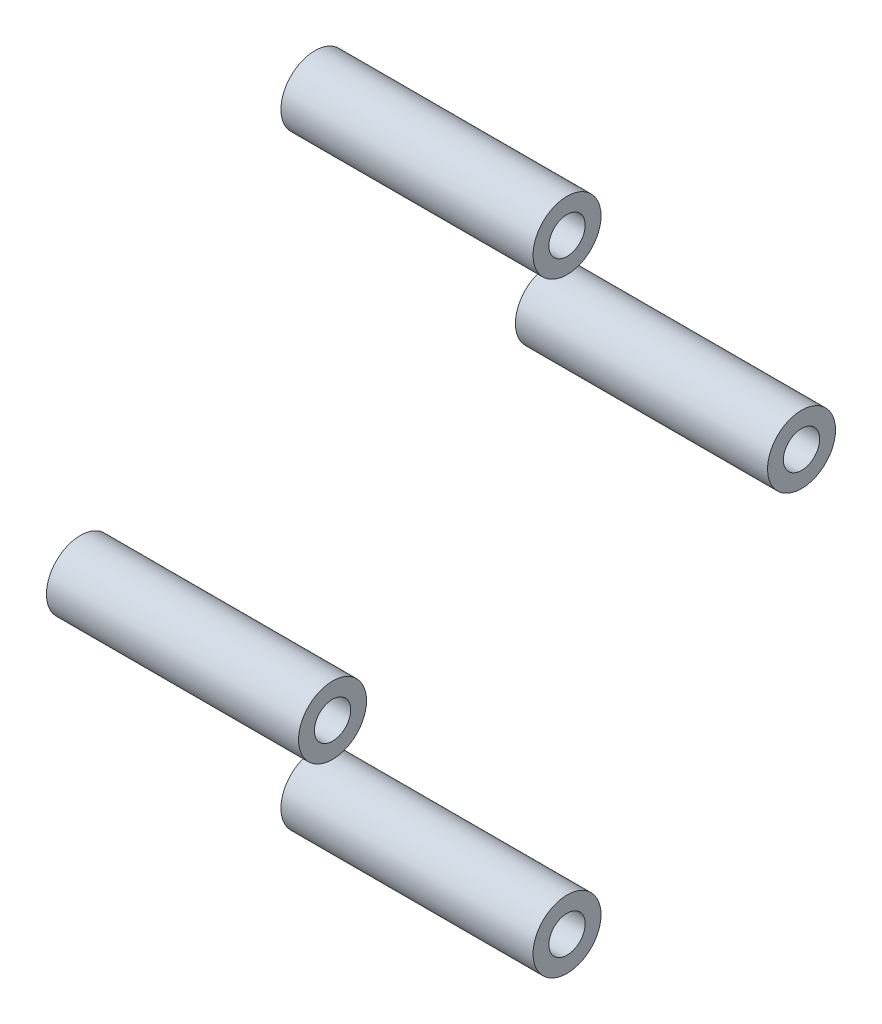
ISO-10303-21;
HEADER;
FILE_DESCRIPTION(('STEP AP214'),'2;1');
FILE_NAME('part.step','',(''),(''),'','','');
FILE_SCHEMA(('AUTOMOTIVE_DESIGN { 1 0 10303 214 1 1 1 1 }'));
ENDSEC;
DATA;
#1=APPLICATION_CONTEXT('core data for automotive mechanical design processes');
#2=APPLICATION_PROTOCOL_DEFINITION('international standard','automotive_design',2000,#1);
#3=PRODUCT_CONTEXT('',#1,'mechanical');
#4=PRODUCT('Part','Part','',(#3));
#5=PRODUCT_RELATED_PRODUCT_CATEGORY('part','',(#4));
#6=PRODUCT_DEFINITION_FORMATION('','',#4);
#7=PRODUCT_DEFINITION_CONTEXT('part definition',#1,'design');
#8=PRODUCT_DEFINITION('design','',#6,#7);
#9=PRODUCT_DEFINITION_SHAPE('','',#8);
#10=(LENGTH_UNIT() NAMED_UNIT(*) SI_UNIT(.MILLI.,.METRE.));
#11=(NAMED_UNIT(*) PLANE_ANGLE_UNIT() SI_UNIT($,.RADIAN.));
#12=(NAMED_UNIT(*) SI_UNIT($,.STERADIAN.) SOLID_ANGLE_UNIT());
#13=UNCERTAINTY_MEASURE_WITH_UNIT(LENGTH_MEASURE(1.E-05),#10,'distance_accuracy_value','');
#14=(GEOMETRIC_REPRESENTATION_CONTEXT(3) GLOBAL_UNCERTAINTY_ASSIGNED_CONTEXT((#13)) GLOBAL_UNIT_ASSIGNED_CONTEXT((#10,
#11,#12)) REPRESENTATION_CONTEXT('',''));
#15=CARTESIAN_POINT('',(0.,0.,0.));
#16=DIRECTION('',(0.,0.,1.));
#17=DIRECTION('',(1.,0.,0.));
#18=AXIS2_PLACEMENT_3D('',#15,#16,#17);
#19=CARTESIAN_POINT('',(25.,-30.,0.));
#20=DIRECTION('',(1.,0.,0.));
#21=DIRECTION('',(0.,0.,-1.));
#22=AXIS2_PLACEMENT_3D('',#19,#20,#21);
#23=PLANE('',#22);
#24=CARTESIAN_POINT('',(25.,-30.,0.));
#25=DIRECTION('',(1.,0.,0.));
#26=DIRECTION('',(0.,0.,-1.));
#27=AXIS2_PLACEMENT_3D('',#24,#25,#26);
#28=CIRCLE('',#27,3.37);
#29=CARTESIAN_POINT('',(25.,-30.,-3.37));
#30=VERTEX_POINT('',#29);
#31=EDGE_CURVE('E56',#30,#30,#28,.T.);
#32=ORIENTED_EDGE('',*,*,#31,.T.);
#33=EDGE_LOOP('',(#32));
#34=FACE_BOUND('',#33,.T.);
#35=CARTESIAN_POINT('',(25.,-30.,0.));
#36=DIRECTION('',(1.,0.,0.));
#37=DIRECTION('',(0.,0.,-1.));
#38=AXIS2_PLACEMENT_3D('',#35,#36,#37);
#39=CIRCLE('',#38,1.8);
#40=CARTESIAN_POINT('',(25.,-30.,-1.8));
#41=VERTEX_POINT('',#40);
#42=EDGE_CURVE('E49',#41,#41,#39,.T.);
#43=ORIENTED_EDGE('',*,*,#42,.F.);
#44=EDGE_LOOP('',(#43));
#45=FACE_BOUND('',#44,.T.);
#46=ADVANCED_FACE('F46',(#34,#45),#23,.T.);
#47=CARTESIAN_POINT('',(0.,-30.,0.));
#48=DIRECTION('',(1.,0.,0.));
#49=DIRECTION('',(0.,0.,-1.));
#50=AXIS2_PLACEMENT_3D('',#47,#48,#49);
#51=PLANE('',#50);
#52=CARTESIAN_POINT('',(0.,-30.,0.));
#53=DIRECTION('',(1.,0.,0.));
#54=DIRECTION('',(0.,0.,-1.));
#55=AXIS2_PLACEMENT_3D('',#52,#53,#54);
#56=CIRCLE('',#55,3.37);
#57=CARTESIAN_POINT('',(0.,-30.,-3.37));
#58=VERTEX_POINT('',#57);
#59=EDGE_CURVE('E60',#58,#58,#56,.T.);
#60=ORIENTED_EDGE('',*,*,#59,.F.);
#61=EDGE_LOOP('',(#60));
#62=FACE_BOUND('',#61,.T.);
#63=CARTESIAN_POINT('',(0.,-30.,0.));
#64=DIRECTION('',(1.,0.,0.));
#65=DIRECTION('',(0.,0.,-1.));
#66=AXIS2_PLACEMENT_3D('',#63,#64,#65);
#67=CIRCLE('',#66,1.8);
#68=CARTESIAN_POINT('',(0.,-30.,-1.8));
#69=VERTEX_POINT('',#68);
#70=EDGE_CURVE('E11',#69,#69,#67,.T.);
#71=ORIENTED_EDGE('',*,*,#70,.T.);
#72=EDGE_LOOP('',(#71));
#73=FACE_BOUND('',#72,.T.);
#74=ADVANCED_FACE('F70',(#62,#73),#51,.F.);
#75=CARTESIAN_POINT('',(25.,-30.,0.));
#76=DIRECTION('',(-1.,0.,0.));
#77=DIRECTION('',(0.,0.,1.));
#78=AXIS2_PLACEMENT_3D('',#75,#76,#77);
#79=CYLINDRICAL_SURFACE('',#78,3.37);
#80=ORIENTED_EDGE('',*,*,#31,.F.);
#81=EDGE_LOOP('',(#80));
#82=FACE_BOUND('',#81,.T.);
#83=ORIENTED_EDGE('',*,*,#59,.T.);
#84=EDGE_LOOP('',(#83));
#85=FACE_BOUND('',#84,.T.);
#86=ADVANCED_FACE('F62',(#82,#85),#79,.T.);
#87=CARTESIAN_POINT('',(25.,-30.,0.));
#88=DIRECTION('',(-1.,0.,0.));
#89=DIRECTION('',(0.,0.,1.));
#90=AXIS2_PLACEMENT_3D('',#87,#88,#89);
#91=CYLINDRICAL_SURFACE('',#90,1.8);
#92=ORIENTED_EDGE('',*,*,#42,.T.);
#93=EDGE_LOOP('',(#92));
#94=FACE_BOUND('',#93,.T.);
#95=ORIENTED_EDGE('',*,*,#70,.F.);
#96=EDGE_LOOP('',(#95));
#97=FACE_BOUND('',#96,.T.);
#98=ADVANCED_FACE('F48',(#94,#97),#91,.F.);
#99=CLOSED_SHELL('',(#46,#74,#86,#98));
#100=MANIFOLD_SOLID_BREP('B2',#99);
#101=CARTESIAN_POINT('',(25.,0.,-23.25));
#102=DIRECTION('',(1.,0.,0.));
#103=DIRECTION('',(0.,0.,-1.));
#104=AXIS2_PLACEMENT_3D('',#101,#102,#103);
#105=PLANE('',#104);
#106=CARTESIAN_POINT('',(25.,0.,-23.25));
#107=DIRECTION('',(1.,0.,0.));
#108=DIRECTION('',(0.,0.,-1.));
#109=AXIS2_PLACEMENT_3D('',#106,#107,#108);
#110=CIRCLE('',#109,3.37);
#111=CARTESIAN_POINT('',(25.,0.,-26.62));
#112=VERTEX_POINT('',#111);
#113=EDGE_CURVE('E129',#112,#112,#110,.T.);
#114=ORIENTED_EDGE('',*,*,#113,.T.);
#115=EDGE_LOOP('',(#114));
#116=FACE_BOUND('',#115,.T.);
#117=CARTESIAN_POINT('',(25.,0.,-23.25));
#118=DIRECTION('',(1.,0.,0.));
#119=DIRECTION('',(0.,0.,-1.));
#120=AXIS2_PLACEMENT_3D('',#117,#118,#119);
#121=CIRCLE('',#120,1.8);
#122=CARTESIAN_POINT('',(25.,0.,-25.05));
#123=VERTEX_POINT('',#122);
#124=EDGE_CURVE('E117',#123,#123,#121,.T.);
#125=ORIENTED_EDGE('',*,*,#124,.F.);
#126=EDGE_LOOP('',(#125));
#127=FACE_BOUND('',#126,.T.);
#128=ADVANCED_FACE('F118',(#116,#127),#105,.T.);
#129=CARTESIAN_POINT('',(0.,0.,-23.25));
#130=DIRECTION('',(1.,0.,0.));
#131=DIRECTION('',(0.,0.,-1.));
#132=AXIS2_PLACEMENT_3D('',#129,#130,#131);
#133=PLANE('',#132);
#134=CARTESIAN_POINT('',(0.,0.,-23.25));
#135=DIRECTION('',(1.,0.,0.));
#136=DIRECTION('',(0.,0.,-1.));
#137=AXIS2_PLACEMENT_3D('',#134,#135,#136);
#138=CIRCLE('',#137,3.37);
#139=CARTESIAN_POINT('',(0.,0.,-26.62));
#140=VERTEX_POINT('',#139);
#141=EDGE_CURVE('E130',#140,#140,#138,.T.);
#142=ORIENTED_EDGE('',*,*,#141,.F.);
#143=EDGE_LOOP('',(#142));
#144=FACE_BOUND('',#143,.T.);
#145=CARTESIAN_POINT('',(0.,0.,-23.25));
#146=DIRECTION('',(1.,0.,0.));
#147=DIRECTION('',(0.,0.,-1.));
#148=AXIS2_PLACEMENT_3D('',#145,#146,#147);
#149=CIRCLE('',#148,1.8);
#150=CARTESIAN_POINT('',(0.,0.,-25.05));
#151=VERTEX_POINT('',#150);
#152=EDGE_CURVE('E44',#151,#151,#149,.T.);
#153=ORIENTED_EDGE('',*,*,#152,.T.);
#154=EDGE_LOOP('',(#153));
#155=FACE_BOUND('',#154,.T.);
#156=ADVANCED_FACE('F140',(#144,#155),#133,.F.);
#157=CARTESIAN_POINT('',(25.,0.,-23.25));
#158=DIRECTION('',(-1.,0.,0.));
#159=DIRECTION('',(0.,0.,1.));
#160=AXIS2_PLACEMENT_3D('',#157,#158,#159);
#161=CYLINDRICAL_SURFACE('',#160,3.37);
#162=ORIENTED_EDGE('',*,*,#113,.F.);
#163=EDGE_LOOP('',(#162));
#164=FACE_BOUND('',#163,.T.);
#165=ORIENTED_EDGE('',*,*,#141,.T.);
#166=EDGE_LOOP('',(#165));
#167=FACE_BOUND('',#166,.T.);
#168=ADVANCED_FACE('F134',(#164,#167),#161,.T.);
#169=CARTESIAN_POINT('',(25.,0.,-23.25));
#170=DIRECTION('',(-1.,0.,0.));
#171=DIRECTION('',(0.,0.,1.));
#172=AXIS2_PLACEMENT_3D('',#169,#170,#171);
#173=CYLINDRICAL_SURFACE('',#172,1.8);
#174=ORIENTED_EDGE('',*,*,#124,.T.);
#175=EDGE_LOOP('',(#174));
#176=FACE_BOUND('',#175,.T.);
#177=ORIENTED_EDGE('',*,*,#152,.F.);
#178=EDGE_LOOP('',(#177));
#179=FACE_BOUND('',#178,.T.);
#180=ADVANCED_FACE('F116',(#176,#179),#173,.F.);
#181=CLOSED_SHELL('',(#128,#156,#168,#180));
#182=MANIFOLD_SOLID_BREP('B6',#181);
#183=CARTESIAN_POINT('',(25.,30.,0.));
#184=DIRECTION('',(1.,0.,0.));
#185=DIRECTION('',(0.,0.,-1.));
#186=AXIS2_PLACEMENT_3D('',#183,#184,#185);
#187=PLANE('',#186);
#188=CARTESIAN_POINT('',(25.,30.,0.));
#189=DIRECTION('',(1.,0.,0.));
#190=DIRECTION('',(0.,0.,-1.));
#191=AXIS2_PLACEMENT_3D('',#188,#189,#190);
#192=CIRCLE('',#191,3.36999999999999);
#193=CARTESIAN_POINT('',(25.,30.,-3.36999999999998));
#194=VERTEX_POINT('',#193);
#195=EDGE_CURVE('E196',#194,#194,#192,.T.);
#196=ORIENTED_EDGE('',*,*,#195,.T.);
#197=EDGE_LOOP('',(#196));
#198=FACE_BOUND('',#197,.T.);
#199=CARTESIAN_POINT('',(25.,30.,0.));
#200=DIRECTION('',(1.,0.,0.));
#201=DIRECTION('',(0.,0.,-1.));
#202=AXIS2_PLACEMENT_3D('',#199,#200,#201);
#203=CIRCLE('',#202,1.79999999999999);
#204=CARTESIAN_POINT('',(25.,30.,-1.79999999999998));
#205=VERTEX_POINT('',#204);
#206=EDGE_CURVE('E188',#205,#205,#203,.T.);
#207=ORIENTED_EDGE('',*,*,#206,.F.);
#208=EDGE_LOOP('',(#207));
#209=FACE_BOUND('',#208,.T.);
#210=ADVANCED_FACE('F184',(#198,#209),#187,.T.);
#211=CARTESIAN_POINT('',(0.,30.,0.));
#212=DIRECTION('',(1.,0.,0.));
#213=DIRECTION('',(0.,0.,-1.));
#214=AXIS2_PLACEMENT_3D('',#211,#212,#213);
#215=PLANE('',#214);
#216=CARTESIAN_POINT('',(0.,30.,0.));
#217=DIRECTION('',(1.,0.,0.));
#218=DIRECTION('',(0.,0.,-1.));
#219=AXIS2_PLACEMENT_3D('',#216,#217,#218);
#220=CIRCLE('',#219,3.36999999999999);
#221=CARTESIAN_POINT('',(0.,30.,-3.36999999999998));
#222=VERTEX_POINT('',#221);
#223=EDGE_CURVE('E198',#222,#222,#220,.T.);
#224=ORIENTED_EDGE('',*,*,#223,.F.);
#225=EDGE_LOOP('',(#224));
#226=FACE_BOUND('',#225,.T.);
#227=CARTESIAN_POINT('',(0.,30.,0.));
#228=DIRECTION('',(1.,0.,0.));
#229=DIRECTION('',(0.,0.,-1.));
#230=AXIS2_PLACEMENT_3D('',#227,#228,#229);
#231=CIRCLE('',#230,1.79999999999999);
#232=CARTESIAN_POINT('',(0.,30.,-1.79999999999998));
#233=VERTEX_POINT('',#232);
#234=EDGE_CURVE('E113',#233,#233,#231,.T.);
#235=ORIENTED_EDGE('',*,*,#234,.T.);
#236=EDGE_LOOP('',(#235));
#237=FACE_BOUND('',#236,.T.);
#238=ADVANCED_FACE('F208',(#226,#237),#215,.F.);
#239=CARTESIAN_POINT('',(25.,30.,0.));
#240=DIRECTION('',(-1.,0.,0.));
#241=DIRECTION('',(0.,0.,1.));
#242=AXIS2_PLACEMENT_3D('',#239,#240,#241);
#243=CYLINDRICAL_SURFACE('',#242,3.36999999999999);
#244=ORIENTED_EDGE('',*,*,#195,.F.);
#245=EDGE_LOOP('',(#244));
#246=FACE_BOUND('',#245,.T.);
#247=ORIENTED_EDGE('',*,*,#223,.T.);
#248=EDGE_LOOP('',(#247));
#249=FACE_BOUND('',#248,.T.);
#250=ADVANCED_FACE('F204',(#246,#249),#243,.T.);
#251=CARTESIAN_POINT('',(25.,30.,0.));
#252=DIRECTION('',(-1.,0.,0.));
#253=DIRECTION('',(0.,0.,1.));
#254=AXIS2_PLACEMENT_3D('',#251,#252,#253);
#255=CYLINDRICAL_SURFACE('',#254,1.79999999999999);
#256=ORIENTED_EDGE('',*,*,#206,.T.);
#257=EDGE_LOOP('',(#256));
#258=FACE_BOUND('',#257,.T.);
#259=ORIENTED_EDGE('',*,*,#234,.F.);
#260=EDGE_LOOP('',(#259));
#261=FACE_BOUND('',#260,.T.);
#262=ADVANCED_FACE('F190',(#258,#261),#255,.F.);
#263=CLOSED_SHELL('',(#210,#238,#250,#262));
#264=MANIFOLD_SOLID_BREP('B37',#263);
#265=CARTESIAN_POINT('',(25.,0.,23.25));
#266=DIRECTION('',(1.,0.,0.));
#267=DIRECTION('',(0.,0.,-1.));
#268=AXIS2_PLACEMENT_3D('',#265,#266,#267);
#269=PLANE('',#268);
#270=CARTESIAN_POINT('',(25.,0.,23.25));
#271=DIRECTION('',(1.,0.,0.));
#272=DIRECTION('',(0.,0.,-1.));
#273=AXIS2_PLACEMENT_3D('',#270,#271,#272);
#274=CIRCLE('',#273,3.37);
#275=CARTESIAN_POINT('',(25.,0.,19.88));
#276=VERTEX_POINT('',#275);
#277=EDGE_CURVE('E182',#276,#276,#274,.T.);
#278=ORIENTED_EDGE('',*,*,#277,.T.);
#279=EDGE_LOOP('',(#278));
#280=FACE_BOUND('',#279,.T.);
#281=CARTESIAN_POINT('',(25.,0.,23.25));
#282=DIRECTION('',(1.,0.,0.));
#283=DIRECTION('',(0.,0.,-1.));
#284=AXIS2_PLACEMENT_3D('',#281,#282,#283);
#285=CIRCLE('',#284,1.8);
#286=CARTESIAN_POINT('',(25.,0.,21.45));
#287=VERTEX_POINT('',#286);
#288=EDGE_CURVE('E256',#287,#287,#285,.T.);
#289=ORIENTED_EDGE('',*,*,#288,.F.);
#290=EDGE_LOOP('',(#289));
#291=FACE_BOUND('',#290,.T.);
#292=ADVANCED_FACE('F250',(#280,#291),#269,.T.);
#293=CARTESIAN_POINT('',(0.,0.,23.25));
#294=DIRECTION('',(1.,0.,0.));
#295=DIRECTION('',(0.,0.,-1.));
#296=AXIS2_PLACEMENT_3D('',#293,#294,#295);
#297=PLANE('',#296);
#298=CARTESIAN_POINT('',(0.,0.,23.25));
#299=DIRECTION('',(1.,0.,0.));
#300=DIRECTION('',(0.,0.,-1.));
#301=AXIS2_PLACEMENT_3D('',#298,#299,#300);
#302=CIRCLE('',#301,3.37);
#303=CARTESIAN_POINT('',(0.,0.,19.88));
#304=VERTEX_POINT('',#303);
#305=EDGE_CURVE('E253',#304,#304,#302,.T.);
#306=ORIENTED_EDGE('',*,*,#305,.F.);
#307=EDGE_LOOP('',(#306));
#308=FACE_BOUND('',#307,.T.);
#309=CARTESIAN_POINT('',(0.,0.,23.25));
#310=DIRECTION('',(1.,0.,0.));
#311=DIRECTION('',(0.,0.,-1.));
#312=AXIS2_PLACEMENT_3D('',#309,#310,#311);
#313=CIRCLE('',#312,1.8);
#314=CARTESIAN_POINT('',(0.,0.,21.45));
#315=VERTEX_POINT('',#314);
#316=EDGE_CURVE('E259',#315,#315,#313,.T.);
#317=ORIENTED_EDGE('',*,*,#316,.T.);
#318=EDGE_LOOP('',(#317));
#319=FACE_BOUND('',#318,.T.);
#320=ADVANCED_FACE('F269',(#308,#319),#297,.F.);
#321=CARTESIAN_POINT('',(25.,0.,23.25));
#322=DIRECTION('',(-1.,0.,0.));
#323=DIRECTION('',(0.,0.,1.));
#324=AXIS2_PLACEMENT_3D('',#321,#322,#323);
#325=CYLINDRICAL_SURFACE('',#324,3.37);
#326=ORIENTED_EDGE('',*,*,#277,.F.);
#327=EDGE_LOOP('',(#326));
#328=FACE_BOUND('',#327,.T.);
#329=ORIENTED_EDGE('',*,*,#305,.T.);
#330=EDGE_LOOP('',(#329));
#331=FACE_BOUND('',#330,.T.);
#332=ADVANCED_FACE('F249',(#328,#331),#325,.T.);
#333=CARTESIAN_POINT('',(25.,0.,23.25));
#334=DIRECTION('',(-1.,0.,0.));
#335=DIRECTION('',(0.,0.,1.));
#336=AXIS2_PLACEMENT_3D('',#333,#334,#335);
#337=CYLINDRICAL_SURFACE('',#336,1.8);
#338=ORIENTED_EDGE('',*,*,#288,.T.);
#339=EDGE_LOOP('',(#338));
#340=FACE_BOUND('',#339,.T.);
#341=ORIENTED_EDGE('',*,*,#316,.F.);
#342=EDGE_LOOP('',(#341));
#343=FACE_BOUND('',#342,.T.);
#344=ADVANCED_FACE('F266',(#340,#343),#337,.F.);
#345=CLOSED_SHELL('',(#292,#320,#332,#344));
#346=MANIFOLD_SOLID_BREP('B107',#345);
#347=ADVANCED_BREP_SHAPE_REPRESENTATION('',(#18,#100,#182,#264,#346),#14);
#348=SHAPE_DEFINITION_REPRESENTATION(#9,#347);
ENDSEC;
END-ISO-10303-21;
